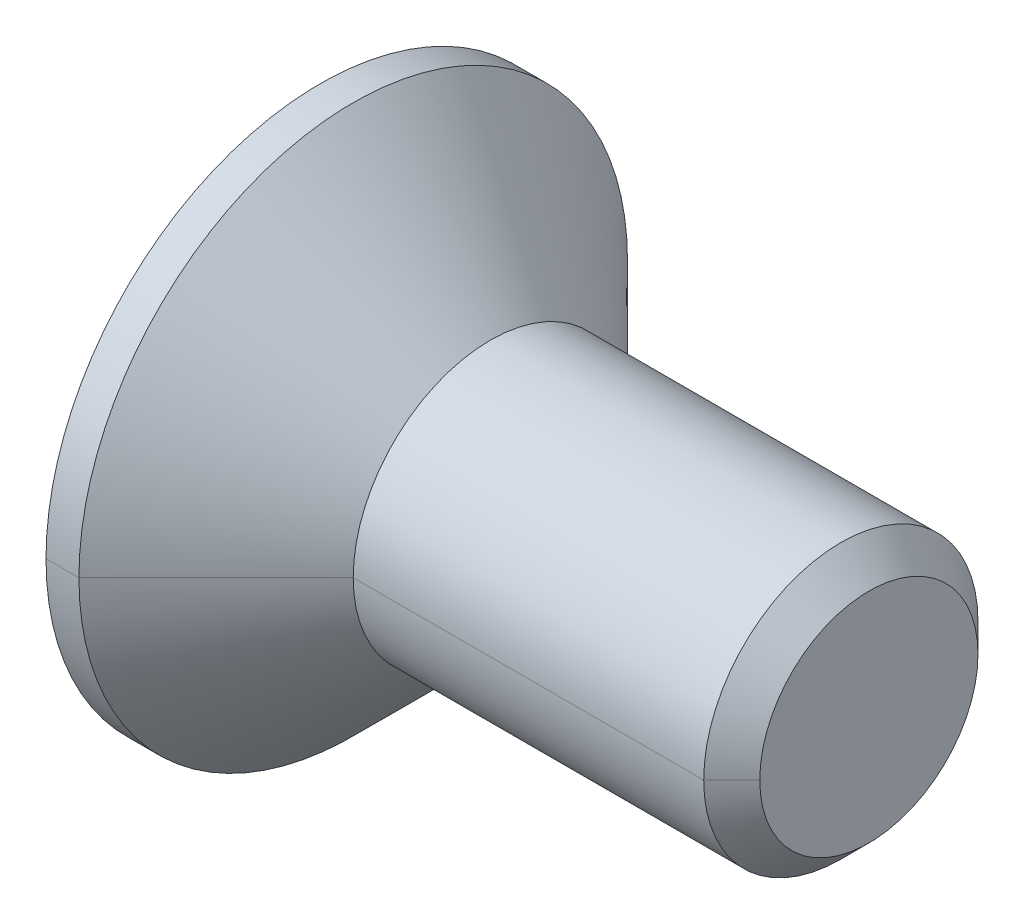
ISO-10303-21;
HEADER;
FILE_DESCRIPTION(('STEP AP214'),'2;1');
FILE_NAME('part.step','',(''),(''),'','','');
FILE_SCHEMA(('AUTOMOTIVE_DESIGN { 1 0 10303 214 1 1 1 1 }'));
ENDSEC;
DATA;
#1=APPLICATION_CONTEXT('core data for automotive mechanical design processes');
#2=APPLICATION_PROTOCOL_DEFINITION('international standard','automotive_design',2000,#1);
#3=PRODUCT_CONTEXT('',#1,'mechanical');
#4=PRODUCT('Part','Part','',(#3));
#5=PRODUCT_RELATED_PRODUCT_CATEGORY('part','',(#4));
#6=PRODUCT_DEFINITION_FORMATION('','',#4);
#7=PRODUCT_DEFINITION_CONTEXT('part definition',#1,'design');
#8=PRODUCT_DEFINITION('design','',#6,#7);
#9=PRODUCT_DEFINITION_SHAPE('','',#8);
#10=(LENGTH_UNIT() NAMED_UNIT(*) SI_UNIT(.MILLI.,.METRE.));
#11=(NAMED_UNIT(*) PLANE_ANGLE_UNIT() SI_UNIT($,.RADIAN.));
#12=(NAMED_UNIT(*) SI_UNIT($,.STERADIAN.) SOLID_ANGLE_UNIT());
#13=UNCERTAINTY_MEASURE_WITH_UNIT(LENGTH_MEASURE(1.E-05),#10,'distance_accuracy_value','');
#14=(GEOMETRIC_REPRESENTATION_CONTEXT(3) GLOBAL_UNCERTAINTY_ASSIGNED_CONTEXT((#13)) GLOBAL_UNIT_ASSIGNED_CONTEXT((#10,
#11,#12)) REPRESENTATION_CONTEXT('',''));
#15=CARTESIAN_POINT('',(0.,0.,0.));
#16=DIRECTION('',(0.,0.,1.));
#17=DIRECTION('',(1.,0.,0.));
#18=AXIS2_PLACEMENT_3D('',#15,#16,#17);
#19=CARTESIAN_POINT('',(4.14000000000001,1.73472347597681E-13,0.));
#20=DIRECTION('',(-1.,0.,0.));
#21=DIRECTION('',(0.,-1.,0.));
#22=AXIS2_PLACEMENT_3D('',#19,#20,#21);
#23=CYLINDRICAL_SURFACE('',#22,3.);
#24=CARTESIAN_POINT('',(-1.5,-1.11022302462516E-13,-2.22044604925031E-13));
#25=DIRECTION('',(1.,0.,0.));
#26=DIRECTION('',(0.,0.,-1.));
#27=AXIS2_PLACEMENT_3D('',#24,#25,#26);
#28=CIRCLE('',#27,3.);
#29=CARTESIAN_POINT('',(-1.49999999999983,-2.28983498828939E-13,-3.00000000000022));
#30=VERTEX_POINT('',#29);
#31=CARTESIAN_POINT('',(-1.50000000000025,-4.30211422042248E-13,3.00000000000003));
#32=VERTEX_POINT('',#31);
#33=EDGE_CURVE('E11',#30,#32,#28,.T.);
#34=ORIENTED_EDGE('',*,*,#33,.F.);
#35=DIRECTION('',(-1.,0.,0.));
#36=VECTOR('',#35,1.);
#37=CARTESIAN_POINT('',(-1.49999999999983,-2.28983498828939E-13,-3.00000000000022));
#38=LINE('',#37,#36);
#39=CARTESIAN_POINT('',(-1.85999999999983,-1.66533453693773E-13,-2.99999999999975));
#40=VERTEX_POINT('',#39);
#41=EDGE_CURVE('E24',#30,#40,#38,.T.);
#42=ORIENTED_EDGE('',*,*,#41,.T.);
#43=CARTESIAN_POINT('',(-1.86,0.,0.));
#44=DIRECTION('',(1.,0.,0.));
#45=DIRECTION('',(0.,0.,-1.));
#46=AXIS2_PLACEMENT_3D('',#43,#44,#45);
#47=CIRCLE('',#46,3.);
#48=CARTESIAN_POINT('',(-1.86000000000025,-1.11022302462516E-13,3.00000000000025));
#49=VERTEX_POINT('',#48);
#50=EDGE_CURVE('E323',#40,#49,#47,.T.);
#51=ORIENTED_EDGE('',*,*,#50,.T.);
#52=DIRECTION('',(-1.,0.,0.));
#53=VECTOR('',#52,1.);
#54=CARTESIAN_POINT('',(-1.50000000000025,-4.30211422042248E-13,3.00000000000003));
#55=LINE('',#54,#53);
#56=EDGE_CURVE('E318',#32,#49,#55,.T.);
#57=ORIENTED_EDGE('',*,*,#56,.F.);
#58=EDGE_LOOP('',(#34,#42,#51,#57));
#59=FACE_BOUND('',#58,.T.);
#60=ADVANCED_FACE('F16',(#59),#23,.T.);
#61=CARTESIAN_POINT('',(4.14000000000001,1.73472347597681E-13,0.));
#62=DIRECTION('',(-1.,0.,0.));
#63=DIRECTION('',(0.,1.,0.));
#64=AXIS2_PLACEMENT_3D('',#61,#62,#63);
#65=CYLINDRICAL_SURFACE('',#64,3.);
#66=CARTESIAN_POINT('',(-1.86,0.,0.));
#67=DIRECTION('',(1.,0.,0.));
#68=DIRECTION('',(0.,0.,-1.));
#69=AXIS2_PLACEMENT_3D('',#66,#67,#68);
#70=CIRCLE('',#69,3.);
#71=EDGE_CURVE('E314',#49,#40,#70,.T.);
#72=ORIENTED_EDGE('',*,*,#71,.T.);
#73=ORIENTED_EDGE('',*,*,#41,.F.);
#74=CARTESIAN_POINT('',(-1.5,-1.11022302462516E-13,-2.22044604925031E-13));
#75=DIRECTION('',(1.,0.,0.));
#76=DIRECTION('',(0.,0.,-1.));
#77=AXIS2_PLACEMENT_3D('',#74,#75,#76);
#78=CIRCLE('',#77,3.);
#79=EDGE_CURVE('E309',#32,#30,#78,.T.);
#80=ORIENTED_EDGE('',*,*,#79,.F.);
#81=ORIENTED_EDGE('',*,*,#56,.T.);
#82=EDGE_LOOP('',(#72,#73,#80,#81));
#83=FACE_BOUND('',#82,.T.);
#84=ADVANCED_FACE('F336',(#83),#65,.T.);
#85=CARTESIAN_POINT('',(-1.5,-1.11022302462516E-13,-2.22044604925031E-13));
#86=DIRECTION('',(-1.,0.,0.));
#87=DIRECTION('',(0.,1.,0.));
#88=AXIS2_PLACEMENT_3D('',#85,#86,#87);
#89=CONICAL_SURFACE('',#88,3.,0.7853981634);
#90=ORIENTED_EDGE('',*,*,#79,.T.);
#91=DIRECTION('',(-0.707106781184743,0.,-0.707106781188355));
#92=VECTOR('',#91,1.);
#93=CARTESIAN_POINT('',(-4.08006961549745E-12,-5.06539254985228E-13,-1.49999999999603));
#94=LINE('',#93,#92);
#95=CARTESIAN_POINT('',(-2.4980018054066E-13,0.,-1.49999999999989));
#96=VERTEX_POINT('',#95);
#97=EDGE_CURVE('E304',#96,#30,#94,.T.);
#98=ORIENTED_EDGE('',*,*,#97,.F.);
#99=CARTESIAN_POINT('',(0.,0.,0.));
#100=DIRECTION('',(1.,0.,0.));
#101=DIRECTION('',(0.,0.,-1.));
#102=AXIS2_PLACEMENT_3D('',#99,#100,#101);
#103=CIRCLE('',#102,1.5);
#104=CARTESIAN_POINT('',(2.4980018054066E-13,-2.77555756156289E-13,1.50000000000017));
#105=VERTEX_POINT('',#104);
#106=EDGE_CURVE('E299',#105,#96,#103,.T.);
#107=ORIENTED_EDGE('',*,*,#106,.F.);
#108=DIRECTION('',(-0.707106781184743,0.,0.707106781188353));
#109=VECTOR('',#108,1.);
#110=CARTESIAN_POINT('',(-3.58046925441613E-12,0.,1.49999999999635));
#111=LINE('',#110,#109);
#112=EDGE_CURVE('E294',#105,#32,#111,.T.);
#113=ORIENTED_EDGE('',*,*,#112,.T.);
#114=EDGE_LOOP('',(#90,#98,#107,#113));
#115=FACE_BOUND('',#114,.T.);
#116=ADVANCED_FACE('F392',(#115),#89,.T.);
#117=CARTESIAN_POINT('',(-1.5,-1.11022302462516E-13,-2.22044604925031E-13));
#118=DIRECTION('',(-1.,0.,0.));
#119=DIRECTION('',(0.,-1.,0.));
#120=AXIS2_PLACEMENT_3D('',#117,#118,#119);
#121=CONICAL_SURFACE('',#120,3.,0.7853981634);
#122=CARTESIAN_POINT('',(0.,0.,0.));
#123=DIRECTION('',(1.,0.,0.));
#124=DIRECTION('',(0.,0.,-1.));
#125=AXIS2_PLACEMENT_3D('',#122,#123,#124);
#126=CIRCLE('',#125,1.5);
#127=EDGE_CURVE('E289',#96,#105,#126,.T.);
#128=ORIENTED_EDGE('',*,*,#127,.F.);
#129=ORIENTED_EDGE('',*,*,#97,.T.);
#130=ORIENTED_EDGE('',*,*,#33,.T.);
#131=ORIENTED_EDGE('',*,*,#112,.F.);
#132=EDGE_LOOP('',(#128,#129,#130,#131));
#133=FACE_BOUND('',#132,.T.);
#134=ADVANCED_FACE('F396',(#133),#121,.T.);
#135=CARTESIAN_POINT('',(4.14000000000001,1.73472347597681E-13,0.));
#136=DIRECTION('',(-1.,0.,0.));
#137=DIRECTION('',(0.,-1.,0.));
#138=AXIS2_PLACEMENT_3D('',#135,#136,#137);
#139=CYLINDRICAL_SURFACE('',#138,1.5);
#140=CARTESIAN_POINT('',(3.8335,-5.68989300120393E-13,-2.4980018054066E-13));
#141=DIRECTION('',(1.,0.,0.));
#142=DIRECTION('',(0.,0.,-1.));
#143=AXIS2_PLACEMENT_3D('',#140,#141,#142);
#144=CIRCLE('',#143,1.5);
#145=CARTESIAN_POINT('',(3.83349999999975,-1.11022302462516E-13,-1.49999999999972));
#146=VERTEX_POINT('',#145);
#147=CARTESIAN_POINT('',(3.83350000000025,-3.33066907387547E-13,1.50000000000011));
#148=VERTEX_POINT('',#147);
#149=EDGE_CURVE('E284',#146,#148,#144,.T.);
#150=ORIENTED_EDGE('',*,*,#149,.F.);
#151=DIRECTION('',(-1.,0.,0.));
#152=VECTOR('',#151,1.);
#153=CARTESIAN_POINT('',(3.83349999999975,-1.11022302462516E-13,-1.49999999999972));
#154=LINE('',#153,#152);
#155=EDGE_CURVE('E279',#146,#96,#154,.T.);
#156=ORIENTED_EDGE('',*,*,#155,.T.);
#157=ORIENTED_EDGE('',*,*,#127,.T.);
#158=DIRECTION('',(-1.,0.,0.));
#159=VECTOR('',#158,1.);
#160=CARTESIAN_POINT('',(3.83350000000025,-3.33066907387547E-13,1.50000000000011));
#161=LINE('',#160,#159);
#162=EDGE_CURVE('E274',#148,#105,#161,.T.);
#163=ORIENTED_EDGE('',*,*,#162,.F.);
#164=EDGE_LOOP('',(#150,#156,#157,#163));
#165=FACE_BOUND('',#164,.T.);
#166=ADVANCED_FACE('F402',(#165),#139,.T.);
#167=CARTESIAN_POINT('',(4.14000000000001,1.73472347597681E-13,0.));
#168=DIRECTION('',(-1.,0.,0.));
#169=DIRECTION('',(0.,1.,0.));
#170=AXIS2_PLACEMENT_3D('',#167,#168,#169);
#171=CYLINDRICAL_SURFACE('',#170,1.5);
#172=ORIENTED_EDGE('',*,*,#106,.T.);
#173=ORIENTED_EDGE('',*,*,#155,.F.);
#174=CARTESIAN_POINT('',(3.8335,-5.68989300120393E-13,-2.4980018054066E-13));
#175=DIRECTION('',(1.,0.,0.));
#176=DIRECTION('',(0.,0.,-1.));
#177=AXIS2_PLACEMENT_3D('',#174,#175,#176);
#178=CIRCLE('',#177,1.5);
#179=EDGE_CURVE('E269',#148,#146,#178,.T.);
#180=ORIENTED_EDGE('',*,*,#179,.F.);
#181=ORIENTED_EDGE('',*,*,#162,.T.);
#182=EDGE_LOOP('',(#172,#173,#180,#181));
#183=FACE_BOUND('',#182,.T.);
#184=ADVANCED_FACE('F406',(#183),#171,.T.);
#185=CARTESIAN_POINT('',(3.8335,-5.68989300120393E-13,-2.4980018054066E-13));
#186=DIRECTION('',(-1.,0.,0.));
#187=DIRECTION('',(0.,1.,0.));
#188=AXIS2_PLACEMENT_3D('',#185,#186,#187);
#189=CONICAL_SURFACE('',#188,1.5,0.7853981634);
#190=ORIENTED_EDGE('',*,*,#179,.T.);
#191=DIRECTION('',(-0.707106781184743,0.,-0.707106781188354));
#192=VECTOR('',#191,1.);
#193=CARTESIAN_POINT('',(4.13999999999898,-2.91433543964104E-13,-1.19349999999904));
#194=LINE('',#193,#192);
#195=CARTESIAN_POINT('',(4.13999999999976,-5.68989300120393E-13,-1.19349999999979));
#196=VERTEX_POINT('',#195);
#197=EDGE_CURVE('E264',#196,#146,#194,.T.);
#198=ORIENTED_EDGE('',*,*,#197,.F.);
#199=CARTESIAN_POINT('',(4.14000000000001,1.73472347597681E-13,0.));
#200=DIRECTION('',(1.,0.,0.));
#201=DIRECTION('',(0.,0.,-1.));
#202=AXIS2_PLACEMENT_3D('',#199,#200,#201);
#203=CIRCLE('',#202,1.1935);
#204=CARTESIAN_POINT('',(4.13999999999939,-3.88578058618805E-13,1.19349999999961));
#205=VERTEX_POINT('',#204);
#206=EDGE_CURVE('E259',#205,#196,#203,.T.);
#207=ORIENTED_EDGE('',*,*,#206,.F.);
#208=DIRECTION('',(-0.707106781184743,0.,0.707106781188351));
#209=VECTOR('',#208,1.);
#210=CARTESIAN_POINT('',(4.13999999999939,-3.88578058618805E-13,1.19349999999961));
#211=LINE('',#210,#209);
#212=EDGE_CURVE('E254',#205,#148,#211,.T.);
#213=ORIENTED_EDGE('',*,*,#212,.T.);
#214=EDGE_LOOP('',(#190,#198,#207,#213));
#215=FACE_BOUND('',#214,.T.);
#216=ADVANCED_FACE('F410',(#215),#189,.T.);
#217=CARTESIAN_POINT('',(3.8335,-5.68989300120393E-13,-2.4980018054066E-13));
#218=DIRECTION('',(-1.,0.,0.));
#219=DIRECTION('',(0.,-1.,0.));
#220=AXIS2_PLACEMENT_3D('',#217,#218,#219);
#221=CONICAL_SURFACE('',#220,1.5,0.7853981634);
#222=CARTESIAN_POINT('',(4.14000000000001,1.73472347597681E-13,0.));
#223=DIRECTION('',(1.,0.,0.));
#224=DIRECTION('',(0.,0.,-1.));
#225=AXIS2_PLACEMENT_3D('',#222,#223,#224);
#226=CIRCLE('',#225,1.1935);
#227=EDGE_CURVE('E249',#196,#205,#226,.T.);
#228=ORIENTED_EDGE('',*,*,#227,.F.);
#229=ORIENTED_EDGE('',*,*,#197,.T.);
#230=ORIENTED_EDGE('',*,*,#149,.T.);
#231=ORIENTED_EDGE('',*,*,#212,.F.);
#232=EDGE_LOOP('',(#228,#229,#230,#231));
#233=FACE_BOUND('',#232,.T.);
#234=ADVANCED_FACE('F414',(#233),#221,.T.);
#235=CARTESIAN_POINT('',(4.14000000000001,1.19349999999974,2.22044604925031E-13));
#236=DIRECTION('',(-1.,0.,0.));
#237=DIRECTION('',(0.,0.,1.));
#238=AXIS2_PLACEMENT_3D('',#235,#236,#237);
#239=PLANE('',#238);
#240=ORIENTED_EDGE('',*,*,#227,.T.);
#241=ORIENTED_EDGE('',*,*,#206,.T.);
#242=EDGE_LOOP('',(#240,#241));
#243=FACE_BOUND('',#242,.T.);
#244=ADVANCED_FACE('F341',(#243),#239,.F.);
#245=CARTESIAN_POINT('',(-1.86,0.,0.));
#246=DIRECTION('',(1.,0.,0.));
#247=DIRECTION('',(0.,0.,-1.));
#248=AXIS2_PLACEMENT_3D('',#245,#246,#247);
#249=PLANE('',#248);
#250=ORIENTED_EDGE('',*,*,#50,.F.);
#251=ORIENTED_EDGE('',*,*,#71,.F.);
#252=EDGE_LOOP('',(#250,#251));
#253=FACE_BOUND('',#252,.T.);
#254=DIRECTION('',(0.,0.500000000000029,-0.866025403784422));
#255=VECTOR('',#254,1.);
#256=CARTESIAN_POINT('',(-1.86,-1.15470053837929,0.));
#257=LINE('',#256,#255);
#258=CARTESIAN_POINT('',(-1.86,-1.15470053837929,0.));
#259=VERTEX_POINT('',#258);
#260=CARTESIAN_POINT('',(-1.86000000000025,-0.577350269189494,-0.999999999999723));
#261=VERTEX_POINT('',#260);
#262=EDGE_CURVE('E245',#259,#261,#257,.T.);
#263=ORIENTED_EDGE('',*,*,#262,.T.);
#264=DIRECTION('',(0.,1.,0.));
#265=VECTOR('',#264,1.);
#266=CARTESIAN_POINT('',(-1.86000000000025,-0.577350269189494,-0.999999999999723));
#267=LINE('',#266,#265);
#268=CARTESIAN_POINT('',(-1.86000000000025,0.577350269189807,-0.999999999999779));
#269=VERTEX_POINT('',#268);
#270=EDGE_CURVE('E241',#261,#269,#267,.T.);
#271=ORIENTED_EDGE('',*,*,#270,.T.);
#272=DIRECTION('',(0.,0.500000000000028,0.866025403784422));
#273=VECTOR('',#272,1.);
#274=CARTESIAN_POINT('',(-1.86000000000025,0.577350269189807,-0.999999999999779));
#275=LINE('',#274,#273);
#276=CARTESIAN_POINT('',(-1.86,1.15470053837924,0.));
#277=VERTEX_POINT('',#276);
#278=EDGE_CURVE('E237',#269,#277,#275,.T.);
#279=ORIENTED_EDGE('',*,*,#278,.T.);
#280=DIRECTION('',(0.,-0.500000000000029,0.866025403784422));
#281=VECTOR('',#280,1.);
#282=CARTESIAN_POINT('',(-1.86,1.15470053837924,0.));
#283=LINE('',#282,#281);
#284=CARTESIAN_POINT('',(-1.85999999999983,0.577350269189716,1.00000000000011));
#285=VERTEX_POINT('',#284);
#286=EDGE_CURVE('E233',#277,#285,#283,.T.);
#287=ORIENTED_EDGE('',*,*,#286,.T.);
#288=DIRECTION('',(0.,-1.,0.));
#289=VECTOR('',#288,1.);
#290=CARTESIAN_POINT('',(-1.85999999999983,0.577350269189716,1.00000000000011));
#291=LINE('',#290,#289);
#292=CARTESIAN_POINT('',(-1.85999999999983,-0.577350269189869,1.00000000000022));
#293=VERTEX_POINT('',#292);
#294=EDGE_CURVE('E229',#285,#293,#291,.T.);
#295=ORIENTED_EDGE('',*,*,#294,.T.);
#296=DIRECTION('',(0.,-0.500000000000028,-0.866025403784422));
#297=VECTOR('',#296,1.);
#298=CARTESIAN_POINT('',(-1.85999999999983,-0.577350269189869,1.00000000000022));
#299=LINE('',#298,#297);
#300=EDGE_CURVE('E225',#293,#259,#299,.T.);
#301=ORIENTED_EDGE('',*,*,#300,.T.);
#302=EDGE_LOOP('',(#263,#271,#279,#287,#295,#301));
#303=FACE_BOUND('',#302,.T.);
#304=ADVANCED_FACE('F337',(#253,#303),#249,.F.);
#305=CARTESIAN_POINT('',(-0.75999999999983,-0.57735026918998,1.));
#306=DIRECTION('',(0.,0.866025403784422,-0.500000000000028));
#307=DIRECTION('',(0.,0.500000000000028,0.866025403784422));
#308=AXIS2_PLACEMENT_3D('',#305,#306,#307);
#309=PLANE('',#308);
#310=ORIENTED_EDGE('',*,*,#300,.F.);
#311=DIRECTION('',(-1.,0.,0.));
#312=VECTOR('',#311,1.);
#313=CARTESIAN_POINT('',(-0.75999999999983,-0.57735026918998,1.));
#314=LINE('',#313,#312);
#315=CARTESIAN_POINT('',(-0.75999999999983,-0.57735026918998,1.));
#316=VERTEX_POINT('',#315);
#317=EDGE_CURVE('E220',#316,#293,#314,.T.);
#318=ORIENTED_EDGE('',*,*,#317,.F.);
#319=DIRECTION('',(0.,-0.500000000000028,-0.866025403784422));
#320=VECTOR('',#319,1.);
#321=CARTESIAN_POINT('',(-0.75999999999983,-0.57735026918998,1.));
#322=LINE('',#321,#320);
#323=CARTESIAN_POINT('',(-0.759999999999914,-0.866025403783888,0.500000000000167));
#324=VERTEX_POINT('',#323);
#325=EDGE_CURVE('E216',#316,#324,#322,.T.);
#326=ORIENTED_EDGE('',*,*,#325,.T.);
#327=DIRECTION('',(0.,-0.500000000000028,-0.866025403784422));
#328=VECTOR('',#327,1.);
#329=CARTESIAN_POINT('',(-0.75999999999983,-0.57735026918998,1.));
#330=LINE('',#329,#328);
#331=CARTESIAN_POINT('',(-0.759999999999997,-1.15470053837935,-1.11022302462516E-13));
#332=VERTEX_POINT('',#331);
#333=EDGE_CURVE('E212',#324,#332,#330,.T.);
#334=ORIENTED_EDGE('',*,*,#333,.T.);
#335=DIRECTION('',(-1.,0.,0.));
#336=VECTOR('',#335,1.);
#337=CARTESIAN_POINT('',(-0.759999999999997,-1.15470053837935,-1.11022302462516E-13));
#338=LINE('',#337,#336);
#339=EDGE_CURVE('E207',#332,#259,#338,.T.);
#340=ORIENTED_EDGE('',*,*,#339,.T.);
#341=EDGE_LOOP('',(#310,#318,#326,#334,#340));
#342=FACE_BOUND('',#341,.T.);
#343=ADVANCED_FACE('F340',(#342),#309,.T.);
#344=CARTESIAN_POINT('',(-0.759999999999997,-1.15470053837935,-1.11022302462516E-13));
#345=DIRECTION('',(0.,0.866025403784422,0.500000000000029));
#346=DIRECTION('',(0.,-0.500000000000029,0.866025403784422));
#347=AXIS2_PLACEMENT_3D('',#344,#345,#346);
#348=PLANE('',#347);
#349=ORIENTED_EDGE('',*,*,#262,.F.);
#350=ORIENTED_EDGE('',*,*,#339,.F.);
#351=DIRECTION('',(0.,0.500000000000029,-0.866025403784422));
#352=VECTOR('',#351,1.);
#353=CARTESIAN_POINT('',(-0.759999999999997,-1.15470053837935,-1.11022302462516E-13));
#354=LINE('',#353,#352);
#355=CARTESIAN_POINT('',(-0.76000000000008,-0.866025403784734,-0.499999999999889));
#356=VERTEX_POINT('',#355);
#357=EDGE_CURVE('E203',#332,#356,#354,.T.);
#358=ORIENTED_EDGE('',*,*,#357,.T.);
#359=DIRECTION('',(0.,0.500000000000029,-0.866025403784422));
#360=VECTOR('',#359,1.);
#361=CARTESIAN_POINT('',(-0.759999999999997,-1.15470053837935,-1.11022302462516E-13));
#362=LINE('',#361,#360);
#363=CARTESIAN_POINT('',(-0.760000000000247,-0.577350269189987,-0.999999999999834));
#364=VERTEX_POINT('',#363);
#365=EDGE_CURVE('E199',#356,#364,#362,.T.);
#366=ORIENTED_EDGE('',*,*,#365,.T.);
#367=DIRECTION('',(-1.,0.,0.));
#368=VECTOR('',#367,1.);
#369=CARTESIAN_POINT('',(-0.760000000000247,-0.577350269189987,-0.999999999999834));
#370=LINE('',#369,#368);
#371=EDGE_CURVE('E194',#364,#261,#370,.T.);
#372=ORIENTED_EDGE('',*,*,#371,.T.);
#373=EDGE_LOOP('',(#349,#350,#358,#366,#372));
#374=FACE_BOUND('',#373,.T.);
#375=ADVANCED_FACE('F349',(#374),#348,.T.);
#376=CARTESIAN_POINT('',(-0.760000000000247,-0.577350269189987,-0.999999999999834));
#377=DIRECTION('',(0.,0.,1.));
#378=DIRECTION('',(1.,0.,0.));
#379=AXIS2_PLACEMENT_3D('',#376,#377,#378);
#380=PLANE('',#379);
#381=ORIENTED_EDGE('',*,*,#270,.F.);
#382=ORIENTED_EDGE('',*,*,#371,.F.);
#383=DIRECTION('',(0.,1.,0.));
#384=VECTOR('',#383,1.);
#385=CARTESIAN_POINT('',(-0.760000000000247,-0.577350269189987,-0.999999999999834));
#386=LINE('',#385,#384);
#387=CARTESIAN_POINT('',(-0.760000000000247,-3.95516952522712E-13,-1.00000000000011));
#388=VERTEX_POINT('',#387);
#389=EDGE_CURVE('E190',#364,#388,#386,.T.);
#390=ORIENTED_EDGE('',*,*,#389,.T.);
#391=DIRECTION('',(0.,1.,0.));
#392=VECTOR('',#391,1.);
#393=CARTESIAN_POINT('',(-0.760000000000247,-0.577350269189987,-0.999999999999834));
#394=LINE('',#393,#392);
#395=CARTESIAN_POINT('',(-0.760000000000247,0.577350269189897,-1.00000000000011));
#396=VERTEX_POINT('',#395);
#397=EDGE_CURVE('E186',#388,#396,#394,.T.);
#398=ORIENTED_EDGE('',*,*,#397,.T.);
#399=DIRECTION('',(-1.,0.,0.));
#400=VECTOR('',#399,1.);
#401=CARTESIAN_POINT('',(-0.760000000000247,0.577350269189897,-1.00000000000011));
#402=LINE('',#401,#400);
#403=EDGE_CURVE('E181',#396,#269,#402,.T.);
#404=ORIENTED_EDGE('',*,*,#403,.T.);
#405=EDGE_LOOP('',(#381,#382,#390,#398,#404));
#406=FACE_BOUND('',#405,.T.);
#407=ADVANCED_FACE('F353',(#406),#380,.T.);
#408=CARTESIAN_POINT('',(-0.760000000000247,0.577350269189897,-1.00000000000011));
#409=DIRECTION('',(0.,-0.866025403784422,0.500000000000028));
#410=DIRECTION('',(0.,-0.500000000000028,-0.866025403784422));
#411=AXIS2_PLACEMENT_3D('',#408,#409,#410);
#412=PLANE('',#411);
#413=ORIENTED_EDGE('',*,*,#278,.F.);
#414=ORIENTED_EDGE('',*,*,#403,.F.);
#415=DIRECTION('',(0.,0.500000000000028,0.866025403784422));
#416=VECTOR('',#415,1.);
#417=CARTESIAN_POINT('',(-0.760000000000247,0.577350269189897,-1.00000000000011));
#418=LINE('',#417,#416);
#419=CARTESIAN_POINT('',(-0.760000000000163,0.866025403784061,-0.500000000000028));
#420=VERTEX_POINT('',#419);
#421=EDGE_CURVE('E177',#396,#420,#418,.T.);
#422=ORIENTED_EDGE('',*,*,#421,.T.);
#423=DIRECTION('',(0.,0.500000000000028,0.866025403784422));
#424=VECTOR('',#423,1.);
#425=CARTESIAN_POINT('',(-0.760000000000247,0.577350269189897,-1.00000000000011));
#426=LINE('',#425,#424);
#427=CARTESIAN_POINT('',(-0.759999999999997,1.15470053837919,0.));
#428=VERTEX_POINT('',#427);
#429=EDGE_CURVE('E173',#420,#428,#426,.T.);
#430=ORIENTED_EDGE('',*,*,#429,.T.);
#431=DIRECTION('',(-1.,0.,0.));
#432=VECTOR('',#431,1.);
#433=CARTESIAN_POINT('',(-0.759999999999997,1.15470053837919,0.));
#434=LINE('',#433,#432);
#435=EDGE_CURVE('E168',#428,#277,#434,.T.);
#436=ORIENTED_EDGE('',*,*,#435,.T.);
#437=EDGE_LOOP('',(#413,#414,#422,#430,#436));
#438=FACE_BOUND('',#437,.T.);
#439=ADVANCED_FACE('F358',(#438),#412,.T.);
#440=CARTESIAN_POINT('',(-0.759999999999997,1.15470053837919,0.));
#441=DIRECTION('',(0.,-0.866025403784422,-0.500000000000029));
#442=DIRECTION('',(0.,0.500000000000029,-0.866025403784422));
#443=AXIS2_PLACEMENT_3D('',#440,#441,#442);
#444=PLANE('',#443);
#445=ORIENTED_EDGE('',*,*,#286,.F.);
#446=ORIENTED_EDGE('',*,*,#435,.F.);
#447=DIRECTION('',(0.,-0.500000000000029,0.866025403784422));
#448=VECTOR('',#447,1.);
#449=CARTESIAN_POINT('',(-0.759999999999997,1.15470053837919,0.));
#450=LINE('',#449,#448);
#451=CARTESIAN_POINT('',(-0.759999999999914,0.866025403784609,0.5));
#452=VERTEX_POINT('',#451);
#453=EDGE_CURVE('E164',#428,#452,#450,.T.);
#454=ORIENTED_EDGE('',*,*,#453,.T.);
#455=DIRECTION('',(0.,-0.500000000000029,0.866025403784422));
#456=VECTOR('',#455,1.);
#457=CARTESIAN_POINT('',(-0.759999999999997,1.15470053837919,0.));
#458=LINE('',#457,#456);
#459=CARTESIAN_POINT('',(-0.75999999999983,0.577350269189356,1.00000000000011));
#460=VERTEX_POINT('',#459);
#461=EDGE_CURVE('E160',#452,#460,#458,.T.);
#462=ORIENTED_EDGE('',*,*,#461,.T.);
#463=DIRECTION('',(-1.,0.,0.));
#464=VECTOR('',#463,1.);
#465=CARTESIAN_POINT('',(-0.75999999999983,0.577350269189356,1.00000000000011));
#466=LINE('',#465,#464);
#467=EDGE_CURVE('E155',#460,#285,#466,.T.);
#468=ORIENTED_EDGE('',*,*,#467,.T.);
#469=EDGE_LOOP('',(#445,#446,#454,#462,#468));
#470=FACE_BOUND('',#469,.T.);
#471=ADVANCED_FACE('F364',(#470),#444,.T.);
#472=CARTESIAN_POINT('',(-0.75999999999983,0.577350269189356,1.00000000000011));
#473=DIRECTION('',(0.,0.,-1.));
#474=DIRECTION('',(-1.,0.,0.));
#475=AXIS2_PLACEMENT_3D('',#472,#473,#474);
#476=PLANE('',#475);
#477=ORIENTED_EDGE('',*,*,#294,.F.);
#478=ORIENTED_EDGE('',*,*,#467,.F.);
#479=DIRECTION('',(0.,-1.,0.));
#480=VECTOR('',#479,1.);
#481=CARTESIAN_POINT('',(-0.75999999999983,0.577350269189356,1.00000000000011));
#482=LINE('',#481,#480);
#483=CARTESIAN_POINT('',(-0.75999999999983,-5.13478148889135E-13,0.99999999999982));
#484=VERTEX_POINT('',#483);
#485=EDGE_CURVE('E151',#460,#484,#482,.T.);
#486=ORIENTED_EDGE('',*,*,#485,.T.);
#487=DIRECTION('',(0.,-1.,0.));
#488=VECTOR('',#487,1.);
#489=CARTESIAN_POINT('',(-0.75999999999983,0.577350269189356,1.00000000000011));
#490=LINE('',#489,#488);
#491=EDGE_CURVE('E138',#484,#316,#490,.T.);
#492=ORIENTED_EDGE('',*,*,#491,.T.);
#493=ORIENTED_EDGE('',*,*,#317,.T.);
#494=EDGE_LOOP('',(#477,#478,#486,#492,#493));
#495=FACE_BOUND('',#494,.T.);
#496=ADVANCED_FACE('F368',(#495),#476,.T.);
#497=CARTESIAN_POINT('',(-0.759999999999997,-4.92661467177413E-13,-2.4980018054066E-13));
#498=DIRECTION('',(1.,0.,0.));
#499=DIRECTION('',(0.,0.,-1.));
#500=AXIS2_PLACEMENT_3D('',#497,#498,#499);
#501=PLANE('',#500);
#502=CARTESIAN_POINT('',(-0.759999999999997,-4.92661467177413E-13,-2.4980018054066E-13));
#503=DIRECTION('',(1.,0.,0.));
#504=DIRECTION('',(0.,0.,-1.));
#505=AXIS2_PLACEMENT_3D('',#502,#503,#504);
#506=CIRCLE('',#505,1.);
#507=EDGE_CURVE('E124',#484,#324,#506,.T.);
#508=ORIENTED_EDGE('',*,*,#507,.T.);
#509=ORIENTED_EDGE('',*,*,#325,.F.);
#510=ORIENTED_EDGE('',*,*,#491,.F.);
#511=EDGE_LOOP('',(#508,#509,#510));
#512=FACE_BOUND('',#511,.T.);
#513=ADVANCED_FACE('F434',(#512),#501,.F.);
#514=CARTESIAN_POINT('',(-0.759999999999997,-4.92661467177413E-13,-2.4980018054066E-13));
#515=DIRECTION('',(-1.,0.,0.));
#516=DIRECTION('',(0.,1.,0.));
#517=AXIS2_PLACEMENT_3D('',#514,#515,#516);
#518=CONICAL_SURFACE('',#517,1.,1.0471975512);
#519=DIRECTION('',(-0.499999999997054,0.,-0.866025403786143));
#520=VECTOR('',#519,1.);
#521=CARTESIAN_POINT('',(-0.182649730814916,0.,0.));
#522=LINE('',#521,#520);
#523=CARTESIAN_POINT('',(-0.182649730810364,0.,0.));
#524=VERTEX_POINT('',#523);
#525=EDGE_CURVE('E120',#524,#388,#522,.T.);
#526=ORIENTED_EDGE('',*,*,#525,.T.);
#527=CARTESIAN_POINT('',(-0.759999999999997,-4.92661467177413E-13,-2.4980018054066E-13));
#528=DIRECTION('',(1.,0.,0.));
#529=DIRECTION('',(0.,0.,-1.));
#530=AXIS2_PLACEMENT_3D('',#527,#528,#529);
#531=CIRCLE('',#530,1.);
#532=EDGE_CURVE('E136',#356,#388,#531,.T.);
#533=ORIENTED_EDGE('',*,*,#532,.F.);
#534=CARTESIAN_POINT('',(-0.759999999999997,-4.92661467177413E-13,-2.4980018054066E-13));
#535=DIRECTION('',(1.,0.,0.));
#536=DIRECTION('',(0.,0.,-1.));
#537=AXIS2_PLACEMENT_3D('',#534,#535,#536);
#538=CIRCLE('',#537,1.);
#539=EDGE_CURVE('E128',#324,#356,#538,.T.);
#540=ORIENTED_EDGE('',*,*,#539,.F.);
#541=ORIENTED_EDGE('',*,*,#507,.F.);
#542=DIRECTION('',(-0.499999999997054,0.,0.86602540378614));
#543=VECTOR('',#542,1.);
#544=CARTESIAN_POINT('',(-0.182649730814916,0.,0.));
#545=LINE('',#544,#543);
#546=EDGE_CURVE('E116',#524,#484,#545,.T.);
#547=ORIENTED_EDGE('',*,*,#546,.F.);
#548=EDGE_LOOP('',(#526,#533,#540,#541,#547));
#549=FACE_BOUND('',#548,.T.);
#550=ADVANCED_FACE('F118',(#549),#518,.F.);
#551=CARTESIAN_POINT('',(-0.759999999999997,-4.92661467177413E-13,-2.4980018054066E-13));
#552=DIRECTION('',(-1.,0.,0.));
#553=DIRECTION('',(0.,-1.,0.));
#554=AXIS2_PLACEMENT_3D('',#551,#552,#553);
#555=CONICAL_SURFACE('',#554,1.,1.0471975512);
#556=ORIENTED_EDGE('',*,*,#546,.T.);
#557=CARTESIAN_POINT('',(-0.759999999999997,-4.92661467177413E-13,-2.4980018054066E-13));
#558=DIRECTION('',(1.,0.,0.));
#559=DIRECTION('',(0.,0.,-1.));
#560=AXIS2_PLACEMENT_3D('',#557,#558,#559);
#561=CIRCLE('',#560,1.);
#562=EDGE_CURVE('E129',#452,#484,#561,.T.);
#563=ORIENTED_EDGE('',*,*,#562,.F.);
#564=CARTESIAN_POINT('',(-0.759999999999997,-4.92661467177413E-13,-2.4980018054066E-13));
#565=DIRECTION('',(1.,0.,0.));
#566=DIRECTION('',(0.,0.,-1.));
#567=AXIS2_PLACEMENT_3D('',#564,#565,#566);
#568=CIRCLE('',#567,1.);
#569=EDGE_CURVE('E455',#420,#452,#568,.T.);
#570=ORIENTED_EDGE('',*,*,#569,.F.);
#571=CARTESIAN_POINT('',(-0.759999999999997,-4.92661467177413E-13,-2.4980018054066E-13));
#572=DIRECTION('',(1.,0.,0.));
#573=DIRECTION('',(0.,0.,-1.));
#574=AXIS2_PLACEMENT_3D('',#571,#572,#573);
#575=CIRCLE('',#574,1.);
#576=EDGE_CURVE('E134',#388,#420,#575,.T.);
#577=ORIENTED_EDGE('',*,*,#576,.F.);
#578=ORIENTED_EDGE('',*,*,#525,.F.);
#579=EDGE_LOOP('',(#556,#563,#570,#577,#578));
#580=FACE_BOUND('',#579,.T.);
#581=ADVANCED_FACE('F131',(#580),#555,.F.);
#582=CARTESIAN_POINT('',(-0.759999999999997,-4.92661467177413E-13,-2.4980018054066E-13));
#583=DIRECTION('',(1.,0.,0.));
#584=DIRECTION('',(0.,0.,-1.));
#585=AXIS2_PLACEMENT_3D('',#582,#583,#584);
#586=PLANE('',#585);
#587=ORIENTED_EDGE('',*,*,#576,.T.);
#588=ORIENTED_EDGE('',*,*,#421,.F.);
#589=ORIENTED_EDGE('',*,*,#397,.F.);
#590=EDGE_LOOP('',(#587,#588,#589));
#591=FACE_BOUND('',#590,.T.);
#592=ADVANCED_FACE('F442',(#591),#586,.F.);
#593=CARTESIAN_POINT('',(-0.759999999999997,-4.92661467177413E-13,-2.4980018054066E-13));
#594=DIRECTION('',(1.,0.,0.));
#595=DIRECTION('',(0.,0.,-1.));
#596=AXIS2_PLACEMENT_3D('',#593,#594,#595);
#597=PLANE('',#596);
#598=ORIENTED_EDGE('',*,*,#429,.F.);
#599=ORIENTED_EDGE('',*,*,#569,.T.);
#600=ORIENTED_EDGE('',*,*,#453,.F.);
#601=EDGE_LOOP('',(#598,#599,#600));
#602=FACE_BOUND('',#601,.T.);
#603=ADVANCED_FACE('F445',(#602),#597,.F.);
#604=CARTESIAN_POINT('',(-0.759999999999997,-4.92661467177413E-13,-2.4980018054066E-13));
#605=DIRECTION('',(1.,0.,0.));
#606=DIRECTION('',(0.,0.,-1.));
#607=AXIS2_PLACEMENT_3D('',#604,#605,#606);
#608=PLANE('',#607);
#609=ORIENTED_EDGE('',*,*,#562,.T.);
#610=ORIENTED_EDGE('',*,*,#485,.F.);
#611=ORIENTED_EDGE('',*,*,#461,.F.);
#612=EDGE_LOOP('',(#609,#610,#611));
#613=FACE_BOUND('',#612,.T.);
#614=ADVANCED_FACE('F386',(#613),#608,.F.);
#615=CARTESIAN_POINT('',(-0.759999999999997,-4.92661467177413E-13,-2.4980018054066E-13));
#616=DIRECTION('',(1.,0.,0.));
#617=DIRECTION('',(0.,0.,-1.));
#618=AXIS2_PLACEMENT_3D('',#615,#616,#617);
#619=PLANE('',#618);
#620=ORIENTED_EDGE('',*,*,#539,.T.);
#621=ORIENTED_EDGE('',*,*,#357,.F.);
#622=ORIENTED_EDGE('',*,*,#333,.F.);
#623=EDGE_LOOP('',(#620,#621,#622));
#624=FACE_BOUND('',#623,.T.);
#625=ADVANCED_FACE('F376',(#624),#619,.F.);
#626=CARTESIAN_POINT('',(-0.759999999999997,-4.92661467177413E-13,-2.4980018054066E-13));
#627=DIRECTION('',(1.,0.,0.));
#628=DIRECTION('',(0.,0.,-1.));
#629=AXIS2_PLACEMENT_3D('',#626,#627,#628);
#630=PLANE('',#629);
#631=ORIENTED_EDGE('',*,*,#532,.T.);
#632=ORIENTED_EDGE('',*,*,#389,.F.);
#633=ORIENTED_EDGE('',*,*,#365,.F.);
#634=EDGE_LOOP('',(#631,#632,#633));
#635=FACE_BOUND('',#634,.T.);
#636=ADVANCED_FACE('F379',(#635),#630,.F.);
#637=CLOSED_SHELL('',(#60,#84,#116,#134,#166,#184,#216,#234,#244,#304,#343,#375,#407,#439,#471,
#496,#513,#550,#581,#592,#603,#614,#625,#636));
#638=MANIFOLD_SOLID_BREP('B1',#637);
#639=ADVANCED_BREP_SHAPE_REPRESENTATION('',(#18,#638),#14);
#640=SHAPE_DEFINITION_REPRESENTATION(#9,#639);
ENDSEC;
END-ISO-10303-21;
